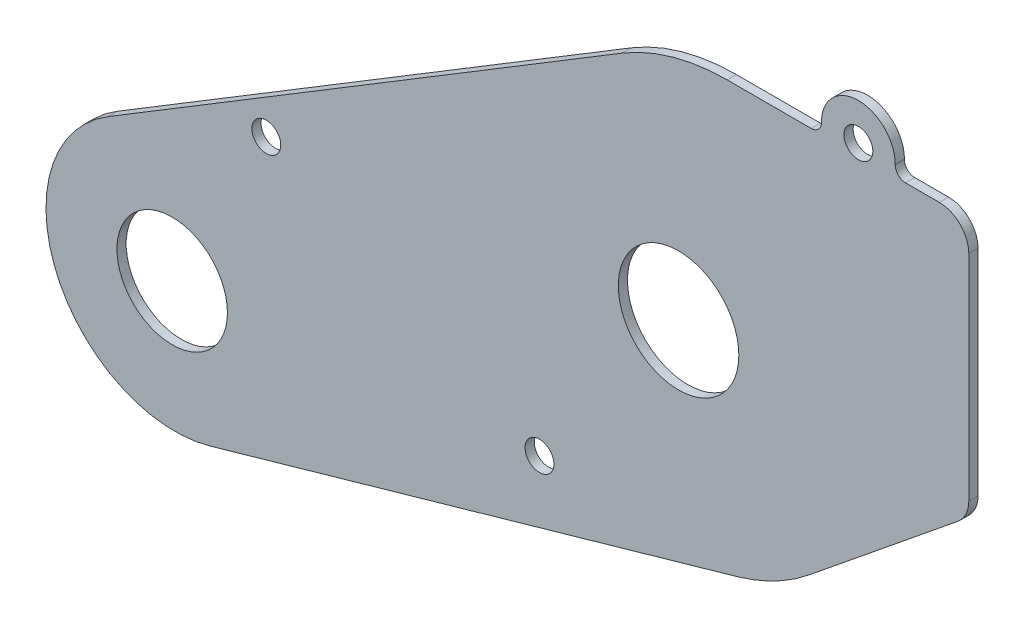
ISO-10303-21;
HEADER;
FILE_DESCRIPTION(('STEP AP214'),'2;1');
FILE_NAME('part.step','',(''),(''),'','','');
FILE_SCHEMA(('AUTOMOTIVE_DESIGN { 1 0 10303 214 1 1 1 1 }'));
ENDSEC;
DATA;
#1=APPLICATION_CONTEXT('core data for automotive mechanical design processes');
#2=APPLICATION_PROTOCOL_DEFINITION('international standard','automotive_design',2000,#1);
#3=PRODUCT_CONTEXT('',#1,'mechanical');
#4=PRODUCT('Part','Part','',(#3));
#5=PRODUCT_RELATED_PRODUCT_CATEGORY('part','',(#4));
#6=PRODUCT_DEFINITION_FORMATION('','',#4);
#7=PRODUCT_DEFINITION_CONTEXT('part definition',#1,'design');
#8=PRODUCT_DEFINITION('design','',#6,#7);
#9=PRODUCT_DEFINITION_SHAPE('','',#8);
#10=(LENGTH_UNIT() NAMED_UNIT(*) SI_UNIT(.MILLI.,.METRE.));
#11=(NAMED_UNIT(*) PLANE_ANGLE_UNIT() SI_UNIT($,.RADIAN.));
#12=(NAMED_UNIT(*) SI_UNIT($,.STERADIAN.) SOLID_ANGLE_UNIT());
#13=UNCERTAINTY_MEASURE_WITH_UNIT(LENGTH_MEASURE(1.E-05),#10,'distance_accuracy_value','');
#14=(GEOMETRIC_REPRESENTATION_CONTEXT(3) GLOBAL_UNCERTAINTY_ASSIGNED_CONTEXT((#13)) GLOBAL_UNIT_ASSIGNED_CONTEXT((#10,
#11,#12)) REPRESENTATION_CONTEXT('',''));
#15=CARTESIAN_POINT('',(0.,0.,0.));
#16=DIRECTION('',(0.,0.,1.));
#17=DIRECTION('',(1.,0.,0.));
#18=AXIS2_PLACEMENT_3D('',#15,#16,#17);
#19=CARTESIAN_POINT('',(59.9572586316337,16.1220844149742,0.));
#20=DIRECTION('',(0.,0.,-1.));
#21=DIRECTION('',(-1.,0.,0.));
#22=AXIS2_PLACEMENT_3D('',#19,#20,#21);
#23=PLANE('',#22);
#24=CARTESIAN_POINT('',(-56.0413692587368,-27.0192229282856,0.));
#25=DIRECTION('',(0.,0.,1.));
#26=DIRECTION('',(1.,0.,0.));
#27=AXIS2_PLACEMENT_3D('',#24,#25,#26);
#28=CIRCLE('',#27,2.4892);
#29=CARTESIAN_POINT('',(-53.5521692587368,-27.0192229282856,0.));
#30=VERTEX_POINT('',#29);
#31=EDGE_CURVE('E342',#30,#30,#28,.T.);
#32=ORIENTED_EDGE('',*,*,#31,.T.);
#33=EDGE_LOOP('',(#32));
#34=FACE_BOUND('',#33,.T.);
#35=CARTESIAN_POINT('',(15.0168097118273,-18.8830683034896,0.));
#36=DIRECTION('',(0.,0.,1.));
#37=DIRECTION('',(1.,0.,0.));
#38=AXIS2_PLACEMENT_3D('',#35,#36,#37);
#39=CIRCLE('',#38,10.3876930189916);
#40=CARTESIAN_POINT('',(25.404502730819,-18.8830683034896,0.));
#41=VERTEX_POINT('',#40);
#42=EDGE_CURVE('E361',#41,#41,#39,.T.);
#43=ORIENTED_EDGE('',*,*,#42,.T.);
#44=EDGE_LOOP('',(#43));
#45=FACE_BOUND('',#44,.T.);
#46=CARTESIAN_POINT('',(59.9572586316337,16.1220844149742,0.));
#47=DIRECTION('',(0.,0.,1.));
#48=DIRECTION('',(-1.,0.,0.));
#49=AXIS2_PLACEMENT_3D('',#46,#47,#48);
#50=CIRCLE('',#49,5.08);
#51=CARTESIAN_POINT('',(65.0372586316337,16.1220844149741,0.));
#52=VERTEX_POINT('',#51);
#53=CARTESIAN_POINT('',(59.9572586316337,21.2020844149742,0.));
#54=VERTEX_POINT('',#53);
#55=EDGE_CURVE('E183',#52,#54,#50,.T.);
#56=ORIENTED_EDGE('',*,*,#55,.F.);
#57=DIRECTION('',(0.,1.,0.));
#58=VECTOR('',#57,1.);
#59=CARTESIAN_POINT('',(65.0372586316337,16.1220844149741,0.));
#60=LINE('',#59,#58);
#61=CARTESIAN_POINT('',(65.0372586316337,-20.8619232159134,0.));
#62=VERTEX_POINT('',#61);
#63=EDGE_CURVE('E113',#62,#52,#60,.T.);
#64=ORIENTED_EDGE('',*,*,#63,.F.);
#65=CARTESIAN_POINT('',(59.9572586316337,-20.8619232159134,0.));
#66=DIRECTION('',(0.,0.,1.));
#67=DIRECTION('',(1.,0.,0.));
#68=AXIS2_PLACEMENT_3D('',#65,#66,#67);
#69=CIRCLE('',#68,5.08);
#70=CARTESIAN_POINT('',(63.1592160975954,-24.8057625110891,0.));
#71=VERTEX_POINT('',#70);
#72=EDGE_CURVE('E107',#71,#62,#69,.T.);
#73=ORIENTED_EDGE('',*,*,#72,.F.);
#74=DIRECTION('',(0.776346317947978,0.630306587787735,0.));
#75=VECTOR('',#74,1.);
#76=CARTESIAN_POINT('',(63.1592160975954,-24.8057625110891,0.));
#77=LINE('',#76,#75);
#78=CARTESIAN_POINT('',(37.5194662101181,-45.6223786135818,0.));
#79=VERTEX_POINT('',#78);
#80=EDGE_CURVE('E173',#79,#71,#77,.T.);
#81=ORIENTED_EDGE('',*,*,#80,.F.);
#82=CARTESIAN_POINT('',(15.5060086316314,-18.5084834592487,0.));
#83=DIRECTION('',(0.,0.,1.));
#84=DIRECTION('',(-1.,0.,0.));
#85=AXIS2_PLACEMENT_3D('',#82,#83,#84);
#86=CIRCLE('',#85,34.925);
#87=CARTESIAN_POINT('',(25.0910579064422,-52.0924447413764,0.));
#88=VERTEX_POINT('',#87);
#89=EDGE_CURVE('E209',#88,#79,#86,.T.);
#90=ORIENTED_EDGE('',*,*,#89,.F.);
#91=DIRECTION('',(0.961602327333648,0.274446650674611,0.));
#92=VECTOR('',#91,1.);
#93=CARTESIAN_POINT('',(25.0910579064422,-52.0924447413764,0.));
#94=LINE('',#93,#92);
#95=CARTESIAN_POINT('',(-65.683756134902,-78.0000813715169,0.));
#96=VERTEX_POINT('',#95);
#97=EDGE_CURVE('E207',#96,#88,#94,.T.);
#98=ORIENTED_EDGE('',*,*,#97,.F.);
#99=CARTESIAN_POINT('',(-71.7833329461452,-56.6284696465266,0.));
#100=DIRECTION('',(0.,0.,1.));
#101=DIRECTION('',(1.,0.,0.));
#102=AXIS2_PLACEMENT_3D('',#99,#100,#101);
#103=CIRCLE('',#102,22.2249999999999);
#104=CARTESIAN_POINT('',(-83.3142465666712,-37.6287681731886,0.));
#105=VERTEX_POINT('',#104);
#106=EDGE_CURVE('E205',#105,#96,#103,.T.);
#107=ORIENTED_EDGE('',*,*,#106,.F.);
#108=DIRECTION('',(-0.854879706336895,-0.518826259641265,0.));
#109=VECTOR('',#108,1.);
#110=CARTESIAN_POINT('',(-83.3142465666712,-37.6287681731886,0.));
#111=LINE('',#110,#109);
#112=CARTESIAN_POINT('',(5.27127097130059,16.1337581587901,0.));
#113=VERTEX_POINT('',#112);
#114=EDGE_CURVE('E203',#113,#105,#111,.T.);
#115=ORIENTED_EDGE('',*,*,#114,.F.);
#116=CARTESIAN_POINT('',(23.3912780892719,-13.7229155850258,0.));
#117=DIRECTION('',(0.,0.,1.));
#118=DIRECTION('',(-1.,0.,0.));
#119=AXIS2_PLACEMENT_3D('',#116,#117,#118);
#120=CIRCLE('',#119,34.925);
#121=CARTESIAN_POINT('',(23.391278089272,21.2020844149742,0.));
#122=VERTEX_POINT('',#121);
#123=EDGE_CURVE('E201',#122,#113,#120,.T.);
#124=ORIENTED_EDGE('',*,*,#123,.F.);
#125=DIRECTION('',(-1.,0.,0.));
#126=VECTOR('',#125,1.);
#127=CARTESIAN_POINT('',(37.8790874286254,21.2020844149742,0.));
#128=LINE('',#127,#126);
#129=CARTESIAN_POINT('',(37.8790874286254,21.2020844149742,0.));
#130=VERTEX_POINT('',#129);
#131=EDGE_CURVE('E199',#130,#122,#128,.T.);
#132=ORIENTED_EDGE('',*,*,#131,.F.);
#133=CARTESIAN_POINT('',(37.8790874286254,22.9800844149742,0.));
#134=DIRECTION('',(0.,0.,-1.));
#135=DIRECTION('',(-1.,0.,0.));
#136=AXIS2_PLACEMENT_3D('',#133,#134,#135);
#137=CIRCLE('',#136,1.778);
#138=CARTESIAN_POINT('',(39.6570874286254,22.9800844149742,0.));
#139=VERTEX_POINT('',#138);
#140=EDGE_CURVE('E197',#139,#130,#137,.T.);
#141=ORIENTED_EDGE('',*,*,#140,.F.);
#142=DIRECTION('',(0.,-1.,0.));
#143=VECTOR('',#142,1.);
#144=CARTESIAN_POINT('',(39.6570874286254,23.0853221728369,0.));
#145=LINE('',#144,#143);
#146=CARTESIAN_POINT('',(39.6570874286254,23.0853221728369,0.));
#147=VERTEX_POINT('',#146);
#148=EDGE_CURVE('E195',#147,#139,#145,.T.);
#149=ORIENTED_EDGE('',*,*,#148,.F.);
#150=CARTESIAN_POINT('',(46.0070874286257,23.0853221728365,0.));
#151=DIRECTION('',(0.,0.,1.));
#152=DIRECTION('',(1.,0.,0.));
#153=AXIS2_PLACEMENT_3D('',#150,#151,#152);
#154=CIRCLE('',#153,6.35000000000033);
#155=CARTESIAN_POINT('',(52.3570874286261,23.0853221728362,0.));
#156=VERTEX_POINT('',#155);
#157=EDGE_CURVE('E193',#156,#147,#154,.T.);
#158=ORIENTED_EDGE('',*,*,#157,.F.);
#159=DIRECTION('',(0.,1.,0.));
#160=VECTOR('',#159,1.);
#161=CARTESIAN_POINT('',(52.3570874286261,23.0853221728362,0.));
#162=LINE('',#161,#160);
#163=CARTESIAN_POINT('',(52.3570874286261,22.9800844149742,0.));
#164=VERTEX_POINT('',#163);
#165=EDGE_CURVE('E191',#164,#156,#162,.T.);
#166=ORIENTED_EDGE('',*,*,#165,.F.);
#167=CARTESIAN_POINT('',(54.1350874286261,22.9800844149742,0.));
#168=DIRECTION('',(0.,0.,-1.));
#169=DIRECTION('',(1.,0.,0.));
#170=AXIS2_PLACEMENT_3D('',#167,#168,#169);
#171=CIRCLE('',#170,1.778);
#172=CARTESIAN_POINT('',(54.1350874286261,21.2020844149742,0.));
#173=VERTEX_POINT('',#172);
#174=EDGE_CURVE('E189',#173,#164,#171,.T.);
#175=ORIENTED_EDGE('',*,*,#174,.F.);
#176=DIRECTION('',(-1.,0.,0.));
#177=VECTOR('',#176,1.);
#178=CARTESIAN_POINT('',(54.1350874286261,21.2020844149742,0.));
#179=LINE('',#178,#177);
#180=EDGE_CURVE('E186',#54,#173,#179,.T.);
#181=ORIENTED_EDGE('',*,*,#180,.F.);
#182=EDGE_LOOP('',(#56,#64,#73,#81,#90,#98,#107,#115,#124,#132,#141,#149,#158,#166,#175,#181));
#183=FACE_BOUND('',#182,.T.);
#184=CARTESIAN_POINT('',(-72.2583329461425,-56.6284683854276,0.));
#185=DIRECTION('',(0.,0.,1.));
#186=DIRECTION('',(1.,0.,0.));
#187=AXIS2_PLACEMENT_3D('',#184,#185,#186);
#188=CIRCLE('',#187,9.52499999999976);
#189=CARTESIAN_POINT('',(-62.7333329461428,-56.6284683854276,0.));
#190=VERTEX_POINT('',#189);
#191=EDGE_CURVE('E365',#190,#190,#188,.T.);
#192=ORIENTED_EDGE('',*,*,#191,.T.);
#193=EDGE_LOOP('',(#192));
#194=FACE_BOUND('',#193,.T.);
#195=CARTESIAN_POINT('',(46.0070874286257,23.0853221728365,0.));
#196=DIRECTION('',(0.,0.,1.));
#197=DIRECTION('',(1.,0.,0.));
#198=AXIS2_PLACEMENT_3D('',#195,#196,#197);
#199=CIRCLE('',#198,2.4892);
#200=CARTESIAN_POINT('',(48.4962874286257,23.0853221728365,0.));
#201=VERTEX_POINT('',#200);
#202=EDGE_CURVE('E358',#201,#201,#199,.T.);
#203=ORIENTED_EDGE('',*,*,#202,.T.);
#204=EDGE_LOOP('',(#203));
#205=FACE_BOUND('',#204,.T.);
#206=CARTESIAN_POINT('',(-8.95127708125045,-51.0906306621196,0.));
#207=DIRECTION('',(0.,0.,1.));
#208=DIRECTION('',(1.,0.,0.));
#209=AXIS2_PLACEMENT_3D('',#206,#207,#208);
#210=CIRCLE('',#209,2.4892);
#211=CARTESIAN_POINT('',(-6.46207708125046,-51.0906306621196,0.));
#212=VERTEX_POINT('',#211);
#213=EDGE_CURVE('E352',#212,#212,#210,.T.);
#214=ORIENTED_EDGE('',*,*,#213,.T.);
#215=EDGE_LOOP('',(#214));
#216=FACE_BOUND('',#215,.T.);
#217=ADVANCED_FACE('F37',(#34,#45,#183,#194,#205,#216),#23,.T.);
#218=CARTESIAN_POINT('',(59.9572586316337,16.1220844149742,1.5875));
#219=DIRECTION('',(0.,0.,-1.));
#220=DIRECTION('',(-1.,0.,0.));
#221=AXIS2_PLACEMENT_3D('',#218,#219,#220);
#222=PLANE('',#221);
#223=CARTESIAN_POINT('',(-56.0413692587368,-27.0192229282856,1.5875));
#224=DIRECTION('',(0.,0.,1.));
#225=DIRECTION('',(1.,0.,0.));
#226=AXIS2_PLACEMENT_3D('',#223,#224,#225);
#227=CIRCLE('',#226,2.4892);
#228=CARTESIAN_POINT('',(-53.5521692587368,-27.0192229282856,1.5875));
#229=VERTEX_POINT('',#228);
#230=EDGE_CURVE('E345',#229,#229,#227,.T.);
#231=ORIENTED_EDGE('',*,*,#230,.F.);
#232=EDGE_LOOP('',(#231));
#233=FACE_BOUND('',#232,.T.);
#234=CARTESIAN_POINT('',(-8.95127708125045,-51.0906306621196,1.5875));
#235=DIRECTION('',(0.,0.,1.));
#236=DIRECTION('',(1.,0.,0.));
#237=AXIS2_PLACEMENT_3D('',#234,#235,#236);
#238=CIRCLE('',#237,2.4892);
#239=CARTESIAN_POINT('',(-6.46207708125046,-51.0906306621196,1.5875));
#240=VERTEX_POINT('',#239);
#241=EDGE_CURVE('E347',#240,#240,#238,.T.);
#242=ORIENTED_EDGE('',*,*,#241,.F.);
#243=EDGE_LOOP('',(#242));
#244=FACE_BOUND('',#243,.T.);
#245=CARTESIAN_POINT('',(46.0070874286257,23.0853221728365,1.5875));
#246=DIRECTION('',(0.,0.,1.));
#247=DIRECTION('',(1.,0.,0.));
#248=AXIS2_PLACEMENT_3D('',#245,#246,#247);
#249=CIRCLE('',#248,2.4892);
#250=CARTESIAN_POINT('',(48.4962874286257,23.0853221728365,1.5875));
#251=VERTEX_POINT('',#250);
#252=EDGE_CURVE('E355',#251,#251,#249,.T.);
#253=ORIENTED_EDGE('',*,*,#252,.F.);
#254=EDGE_LOOP('',(#253));
#255=FACE_BOUND('',#254,.T.);
#256=CARTESIAN_POINT('',(59.9572586316337,16.1220844149742,1.5875));
#257=DIRECTION('',(0.,0.,1.));
#258=DIRECTION('',(-1.,0.,0.));
#259=AXIS2_PLACEMENT_3D('',#256,#257,#258);
#260=CIRCLE('',#259,5.08);
#261=CARTESIAN_POINT('',(65.0372586316337,16.1220844149741,1.5875));
#262=VERTEX_POINT('',#261);
#263=CARTESIAN_POINT('',(59.9572586316337,21.2020844149742,1.5875));
#264=VERTEX_POINT('',#263);
#265=EDGE_CURVE('E214',#262,#264,#260,.T.);
#266=ORIENTED_EDGE('',*,*,#265,.T.);
#267=DIRECTION('',(-1.,0.,0.));
#268=VECTOR('',#267,1.);
#269=CARTESIAN_POINT('',(54.1350874286261,21.2020844149742,1.5875));
#270=LINE('',#269,#268);
#271=CARTESIAN_POINT('',(54.1350874286261,21.2020844149742,1.5875));
#272=VERTEX_POINT('',#271);
#273=EDGE_CURVE('E121',#264,#272,#270,.T.);
#274=ORIENTED_EDGE('',*,*,#273,.T.);
#275=CARTESIAN_POINT('',(54.1350874286261,22.9800844149742,1.5875));
#276=DIRECTION('',(0.,0.,-1.));
#277=DIRECTION('',(1.,0.,0.));
#278=AXIS2_PLACEMENT_3D('',#275,#276,#277);
#279=CIRCLE('',#278,1.778);
#280=CARTESIAN_POINT('',(52.3570874286261,22.9800844149742,1.5875));
#281=VERTEX_POINT('',#280);
#282=EDGE_CURVE('E253',#272,#281,#279,.T.);
#283=ORIENTED_EDGE('',*,*,#282,.T.);
#284=DIRECTION('',(0.,1.,0.));
#285=VECTOR('',#284,1.);
#286=CARTESIAN_POINT('',(52.3570874286261,23.0853221728362,1.5875));
#287=LINE('',#286,#285);
#288=CARTESIAN_POINT('',(52.3570874286261,23.0853221728362,1.5875));
#289=VERTEX_POINT('',#288);
#290=EDGE_CURVE('E271',#281,#289,#287,.T.);
#291=ORIENTED_EDGE('',*,*,#290,.T.);
#292=CARTESIAN_POINT('',(46.0070874286257,23.0853221728365,1.5875));
#293=DIRECTION('',(0.,0.,1.));
#294=DIRECTION('',(1.,0.,0.));
#295=AXIS2_PLACEMENT_3D('',#292,#293,#294);
#296=CIRCLE('',#295,6.35000000000033);
#297=CARTESIAN_POINT('',(39.6570874286254,23.0853221728369,1.5875));
#298=VERTEX_POINT('',#297);
#299=EDGE_CURVE('E268',#289,#298,#296,.T.);
#300=ORIENTED_EDGE('',*,*,#299,.T.);
#301=DIRECTION('',(0.,-1.,0.));
#302=VECTOR('',#301,1.);
#303=CARTESIAN_POINT('',(39.6570874286254,23.0853221728369,1.5875));
#304=LINE('',#303,#302);
#305=CARTESIAN_POINT('',(39.6570874286254,22.9800844149742,1.5875));
#306=VERTEX_POINT('',#305);
#307=EDGE_CURVE('E270',#298,#306,#304,.T.);
#308=ORIENTED_EDGE('',*,*,#307,.T.);
#309=CARTESIAN_POINT('',(37.8790874286254,22.9800844149742,1.5875));
#310=DIRECTION('',(0.,0.,-1.));
#311=DIRECTION('',(-1.,0.,0.));
#312=AXIS2_PLACEMENT_3D('',#309,#310,#311);
#313=CIRCLE('',#312,1.778);
#314=CARTESIAN_POINT('',(37.8790874286254,21.2020844149742,1.5875));
#315=VERTEX_POINT('',#314);
#316=EDGE_CURVE('E273',#306,#315,#313,.T.);
#317=ORIENTED_EDGE('',*,*,#316,.T.);
#318=DIRECTION('',(-1.,0.,0.));
#319=VECTOR('',#318,1.);
#320=CARTESIAN_POINT('',(37.8790874286254,21.2020844149742,1.5875));
#321=LINE('',#320,#319);
#322=CARTESIAN_POINT('',(23.391278089272,21.2020844149742,1.5875));
#323=VERTEX_POINT('',#322);
#324=EDGE_CURVE('E279',#315,#323,#321,.T.);
#325=ORIENTED_EDGE('',*,*,#324,.T.);
#326=CARTESIAN_POINT('',(23.3912780892719,-13.7229155850258,1.5875));
#327=DIRECTION('',(0.,0.,1.));
#328=DIRECTION('',(-1.,0.,0.));
#329=AXIS2_PLACEMENT_3D('',#326,#327,#328);
#330=CIRCLE('',#329,34.925);
#331=CARTESIAN_POINT('',(5.27127097130059,16.1337581587901,1.5875));
#332=VERTEX_POINT('',#331);
#333=EDGE_CURVE('E281',#323,#332,#330,.T.);
#334=ORIENTED_EDGE('',*,*,#333,.T.);
#335=DIRECTION('',(-0.854879706336895,-0.518826259641265,0.));
#336=VECTOR('',#335,1.);
#337=CARTESIAN_POINT('',(-83.3142465666712,-37.6287681731886,1.5875));
#338=LINE('',#337,#336);
#339=CARTESIAN_POINT('',(-83.3142465666712,-37.6287681731886,1.5875));
#340=VERTEX_POINT('',#339);
#341=EDGE_CURVE('E283',#332,#340,#338,.T.);
#342=ORIENTED_EDGE('',*,*,#341,.T.);
#343=CARTESIAN_POINT('',(-71.7833329461452,-56.6284696465266,1.5875));
#344=DIRECTION('',(0.,0.,1.));
#345=DIRECTION('',(1.,0.,0.));
#346=AXIS2_PLACEMENT_3D('',#343,#344,#345);
#347=CIRCLE('',#346,22.2249999999999);
#348=CARTESIAN_POINT('',(-65.683756134902,-78.0000813715169,1.5875));
#349=VERTEX_POINT('',#348);
#350=EDGE_CURVE('E285',#340,#349,#347,.T.);
#351=ORIENTED_EDGE('',*,*,#350,.T.);
#352=DIRECTION('',(0.961602327333648,0.274446650674611,0.));
#353=VECTOR('',#352,1.);
#354=CARTESIAN_POINT('',(25.0910579064422,-52.0924447413764,1.5875));
#355=LINE('',#354,#353);
#356=CARTESIAN_POINT('',(25.0910579064422,-52.0924447413764,1.5875));
#357=VERTEX_POINT('',#356);
#358=EDGE_CURVE('E287',#349,#357,#355,.T.);
#359=ORIENTED_EDGE('',*,*,#358,.T.);
#360=CARTESIAN_POINT('',(15.5060086316314,-18.5084834592487,1.5875));
#361=DIRECTION('',(0.,0.,1.));
#362=DIRECTION('',(-1.,0.,0.));
#363=AXIS2_PLACEMENT_3D('',#360,#361,#362);
#364=CIRCLE('',#363,34.925);
#365=CARTESIAN_POINT('',(37.5194662101181,-45.6223786135818,1.5875));
#366=VERTEX_POINT('',#365);
#367=EDGE_CURVE('E165',#357,#366,#364,.T.);
#368=ORIENTED_EDGE('',*,*,#367,.T.);
#369=DIRECTION('',(0.776346317947978,0.630306587787735,0.));
#370=VECTOR('',#369,1.);
#371=CARTESIAN_POINT('',(63.1592160975954,-24.8057625110891,1.5875));
#372=LINE('',#371,#370);
#373=CARTESIAN_POINT('',(63.1592160975954,-24.8057625110891,1.5875));
#374=VERTEX_POINT('',#373);
#375=EDGE_CURVE('E158',#366,#374,#372,.T.);
#376=ORIENTED_EDGE('',*,*,#375,.T.);
#377=CARTESIAN_POINT('',(59.9572586316337,-20.8619232159134,1.5875));
#378=DIRECTION('',(0.,0.,1.));
#379=DIRECTION('',(1.,0.,0.));
#380=AXIS2_PLACEMENT_3D('',#377,#378,#379);
#381=CIRCLE('',#380,5.08);
#382=CARTESIAN_POINT('',(65.0372586316337,-20.8619232159134,1.5875));
#383=VERTEX_POINT('',#382);
#384=EDGE_CURVE('E163',#374,#383,#381,.T.);
#385=ORIENTED_EDGE('',*,*,#384,.T.);
#386=DIRECTION('',(0.,1.,0.));
#387=VECTOR('',#386,1.);
#388=CARTESIAN_POINT('',(65.0372586316337,16.1220844149741,1.5875));
#389=LINE('',#388,#387);
#390=EDGE_CURVE('E54',#383,#262,#389,.T.);
#391=ORIENTED_EDGE('',*,*,#390,.T.);
#392=EDGE_LOOP('',(#266,#274,#283,#291,#300,#308,#317,#325,#334,#342,#351,#359,#368,#376,#385,#391));
#393=FACE_BOUND('',#392,.T.);
#394=CARTESIAN_POINT('',(-72.2583329461425,-56.6284683854276,1.5875));
#395=DIRECTION('',(0.,0.,1.));
#396=DIRECTION('',(1.,0.,0.));
#397=AXIS2_PLACEMENT_3D('',#394,#395,#396);
#398=CIRCLE('',#397,9.52499999999976);
#399=CARTESIAN_POINT('',(-62.7333329461428,-56.6284683854276,1.5875));
#400=VERTEX_POINT('',#399);
#401=EDGE_CURVE('E187',#400,#400,#398,.T.);
#402=ORIENTED_EDGE('',*,*,#401,.F.);
#403=EDGE_LOOP('',(#402));
#404=FACE_BOUND('',#403,.T.);
#405=CARTESIAN_POINT('',(15.0168097118273,-18.8830683034896,1.5875));
#406=DIRECTION('',(0.,0.,1.));
#407=DIRECTION('',(1.,0.,0.));
#408=AXIS2_PLACEMENT_3D('',#405,#406,#407);
#409=CIRCLE('',#408,10.3876930189916);
#410=CARTESIAN_POINT('',(25.404502730819,-18.8830683034896,1.5875));
#411=VERTEX_POINT('',#410);
#412=EDGE_CURVE('E362',#411,#411,#409,.T.);
#413=ORIENTED_EDGE('',*,*,#412,.F.);
#414=EDGE_LOOP('',(#413));
#415=FACE_BOUND('',#414,.T.);
#416=ADVANCED_FACE('F160',(#233,#244,#255,#393,#404,#415),#222,.F.);
#417=CARTESIAN_POINT('',(59.9572586316337,16.1220844149742,1.5875));
#418=DIRECTION('',(0.,0.,-1.));
#419=DIRECTION('',(-1.,0.,0.));
#420=AXIS2_PLACEMENT_3D('',#417,#418,#419);
#421=CYLINDRICAL_SURFACE('',#420,5.08);
#422=ORIENTED_EDGE('',*,*,#55,.T.);
#423=DIRECTION('',(0.,0.,-1.));
#424=VECTOR('',#423,1.);
#425=CARTESIAN_POINT('',(59.9572586316337,21.2020844149742,1.5875));
#426=LINE('',#425,#424);
#427=EDGE_CURVE('E11',#264,#54,#426,.T.);
#428=ORIENTED_EDGE('',*,*,#427,.F.);
#429=ORIENTED_EDGE('',*,*,#265,.F.);
#430=DIRECTION('',(0.,0.,-1.));
#431=VECTOR('',#430,1.);
#432=CARTESIAN_POINT('',(65.0372586316337,16.1220844149741,1.5875));
#433=LINE('',#432,#431);
#434=EDGE_CURVE('E179',#262,#52,#433,.T.);
#435=ORIENTED_EDGE('',*,*,#434,.T.);
#436=EDGE_LOOP('',(#422,#428,#429,#435));
#437=FACE_BOUND('',#436,.T.);
#438=ADVANCED_FACE('F39',(#437),#421,.T.);
#439=CARTESIAN_POINT('',(54.1350874286261,21.2020844149742,1.5875));
#440=DIRECTION('',(0.,-1.,0.));
#441=DIRECTION('',(1.,0.,0.));
#442=AXIS2_PLACEMENT_3D('',#439,#440,#441);
#443=PLANE('',#442);
#444=ORIENTED_EDGE('',*,*,#180,.T.);
#445=DIRECTION('',(0.,0.,-1.));
#446=VECTOR('',#445,1.);
#447=CARTESIAN_POINT('',(54.1350874286261,21.2020844149742,1.5875));
#448=LINE('',#447,#446);
#449=EDGE_CURVE('E46',#272,#173,#448,.T.);
#450=ORIENTED_EDGE('',*,*,#449,.F.);
#451=ORIENTED_EDGE('',*,*,#273,.F.);
#452=ORIENTED_EDGE('',*,*,#427,.T.);
#453=EDGE_LOOP('',(#444,#450,#451,#452));
#454=FACE_BOUND('',#453,.T.);
#455=ADVANCED_FACE('F540',(#454),#443,.F.);
#456=CARTESIAN_POINT('',(54.1350874286261,22.9800844149742,1.5875));
#457=DIRECTION('',(0.,0.,-1.));
#458=DIRECTION('',(-1.,0.,0.));
#459=AXIS2_PLACEMENT_3D('',#456,#457,#458);
#460=CYLINDRICAL_SURFACE('',#459,1.778);
#461=ORIENTED_EDGE('',*,*,#174,.T.);
#462=DIRECTION('',(0.,0.,-1.));
#463=VECTOR('',#462,1.);
#464=CARTESIAN_POINT('',(52.3570874286261,22.9800844149742,1.5875));
#465=LINE('',#464,#463);
#466=EDGE_CURVE('E245',#281,#164,#465,.T.);
#467=ORIENTED_EDGE('',*,*,#466,.F.);
#468=ORIENTED_EDGE('',*,*,#282,.F.);
#469=ORIENTED_EDGE('',*,*,#449,.T.);
#470=EDGE_LOOP('',(#461,#467,#468,#469));
#471=FACE_BOUND('',#470,.T.);
#472=ADVANCED_FACE('F251',(#471),#460,.F.);
#473=CARTESIAN_POINT('',(52.3570874286261,23.0853221728362,1.5875));
#474=DIRECTION('',(-1.,0.,0.));
#475=DIRECTION('',(0.,0.,1.));
#476=AXIS2_PLACEMENT_3D('',#473,#474,#475);
#477=PLANE('',#476);
#478=ORIENTED_EDGE('',*,*,#165,.T.);
#479=DIRECTION('',(0.,0.,-1.));
#480=VECTOR('',#479,1.);
#481=CARTESIAN_POINT('',(52.3570874286261,23.0853221728362,1.5875));
#482=LINE('',#481,#480);
#483=EDGE_CURVE('E242',#289,#156,#482,.T.);
#484=ORIENTED_EDGE('',*,*,#483,.F.);
#485=ORIENTED_EDGE('',*,*,#290,.F.);
#486=ORIENTED_EDGE('',*,*,#466,.T.);
#487=EDGE_LOOP('',(#478,#484,#485,#486));
#488=FACE_BOUND('',#487,.T.);
#489=ADVANCED_FACE('F262',(#488),#477,.F.);
#490=CARTESIAN_POINT('',(46.0070874286257,23.0853221728365,1.5875));
#491=DIRECTION('',(0.,0.,-1.));
#492=DIRECTION('',(-1.,0.,0.));
#493=AXIS2_PLACEMENT_3D('',#490,#491,#492);
#494=CYLINDRICAL_SURFACE('',#493,6.35000000000033);
#495=ORIENTED_EDGE('',*,*,#157,.T.);
#496=DIRECTION('',(0.,0.,-1.));
#497=VECTOR('',#496,1.);
#498=CARTESIAN_POINT('',(39.6570874286254,23.0853221728369,1.5875));
#499=LINE('',#498,#497);
#500=EDGE_CURVE('E239',#298,#147,#499,.T.);
#501=ORIENTED_EDGE('',*,*,#500,.F.);
#502=ORIENTED_EDGE('',*,*,#299,.F.);
#503=ORIENTED_EDGE('',*,*,#483,.T.);
#504=EDGE_LOOP('',(#495,#501,#502,#503));
#505=FACE_BOUND('',#504,.T.);
#506=ADVANCED_FACE('F266',(#505),#494,.T.);
#507=CARTESIAN_POINT('',(39.6570874286254,23.0853221728369,1.5875));
#508=DIRECTION('',(1.,0.,0.));
#509=DIRECTION('',(0.,0.,-1.));
#510=AXIS2_PLACEMENT_3D('',#507,#508,#509);
#511=PLANE('',#510);
#512=ORIENTED_EDGE('',*,*,#148,.T.);
#513=DIRECTION('',(0.,0.,-1.));
#514=VECTOR('',#513,1.);
#515=CARTESIAN_POINT('',(39.6570874286254,22.9800844149742,1.5875));
#516=LINE('',#515,#514);
#517=EDGE_CURVE('E236',#306,#139,#516,.T.);
#518=ORIENTED_EDGE('',*,*,#517,.F.);
#519=ORIENTED_EDGE('',*,*,#307,.F.);
#520=ORIENTED_EDGE('',*,*,#500,.T.);
#521=EDGE_LOOP('',(#512,#518,#519,#520));
#522=FACE_BOUND('',#521,.T.);
#523=ADVANCED_FACE('F501',(#522),#511,.F.);
#524=CARTESIAN_POINT('',(37.8790874286254,22.9800844149742,1.5875));
#525=DIRECTION('',(0.,0.,-1.));
#526=DIRECTION('',(-1.,0.,0.));
#527=AXIS2_PLACEMENT_3D('',#524,#525,#526);
#528=CYLINDRICAL_SURFACE('',#527,1.778);
#529=ORIENTED_EDGE('',*,*,#140,.T.);
#530=DIRECTION('',(0.,0.,-1.));
#531=VECTOR('',#530,1.);
#532=CARTESIAN_POINT('',(37.8790874286254,21.2020844149742,1.5875));
#533=LINE('',#532,#531);
#534=EDGE_CURVE('E233',#315,#130,#533,.T.);
#535=ORIENTED_EDGE('',*,*,#534,.F.);
#536=ORIENTED_EDGE('',*,*,#316,.F.);
#537=ORIENTED_EDGE('',*,*,#517,.T.);
#538=EDGE_LOOP('',(#529,#535,#536,#537));
#539=FACE_BOUND('',#538,.T.);
#540=ADVANCED_FACE('F490',(#539),#528,.F.);
#541=CARTESIAN_POINT('',(37.8790874286254,21.2020844149742,1.5875));
#542=DIRECTION('',(0.,-1.,0.));
#543=DIRECTION('',(1.,0.,0.));
#544=AXIS2_PLACEMENT_3D('',#541,#542,#543);
#545=PLANE('',#544);
#546=ORIENTED_EDGE('',*,*,#131,.T.);
#547=DIRECTION('',(0.,0.,-1.));
#548=VECTOR('',#547,1.);
#549=CARTESIAN_POINT('',(23.391278089272,21.2020844149742,1.5875));
#550=LINE('',#549,#548);
#551=EDGE_CURVE('E230',#323,#122,#550,.T.);
#552=ORIENTED_EDGE('',*,*,#551,.F.);
#553=ORIENTED_EDGE('',*,*,#324,.F.);
#554=ORIENTED_EDGE('',*,*,#534,.T.);
#555=EDGE_LOOP('',(#546,#552,#553,#554));
#556=FACE_BOUND('',#555,.T.);
#557=ADVANCED_FACE('F479',(#556),#545,.F.);
#558=CARTESIAN_POINT('',(23.3912780892719,-13.7229155850258,1.5875));
#559=DIRECTION('',(0.,0.,-1.));
#560=DIRECTION('',(-1.,0.,0.));
#561=AXIS2_PLACEMENT_3D('',#558,#559,#560);
#562=CYLINDRICAL_SURFACE('',#561,34.925);
#563=ORIENTED_EDGE('',*,*,#123,.T.);
#564=DIRECTION('',(0.,0.,-1.));
#565=VECTOR('',#564,1.);
#566=CARTESIAN_POINT('',(5.27127097130059,16.1337581587901,1.5875));
#567=LINE('',#566,#565);
#568=EDGE_CURVE('E227',#332,#113,#567,.T.);
#569=ORIENTED_EDGE('',*,*,#568,.F.);
#570=ORIENTED_EDGE('',*,*,#333,.F.);
#571=ORIENTED_EDGE('',*,*,#551,.T.);
#572=EDGE_LOOP('',(#563,#569,#570,#571));
#573=FACE_BOUND('',#572,.T.);
#574=ADVANCED_FACE('F468',(#573),#562,.T.);
#575=CARTESIAN_POINT('',(-83.3142465666712,-37.6287681731886,1.5875));
#576=DIRECTION('',(0.518826259641264,-0.854879706336895,0.));
#577=DIRECTION('',(0.854879706336895,0.518826259641265,0.));
#578=AXIS2_PLACEMENT_3D('',#575,#576,#577);
#579=PLANE('',#578);
#580=ORIENTED_EDGE('',*,*,#114,.T.);
#581=DIRECTION('',(0.,0.,-1.));
#582=VECTOR('',#581,1.);
#583=CARTESIAN_POINT('',(-83.3142465666712,-37.6287681731886,1.5875));
#584=LINE('',#583,#582);
#585=EDGE_CURVE('E224',#340,#105,#584,.T.);
#586=ORIENTED_EDGE('',*,*,#585,.F.);
#587=ORIENTED_EDGE('',*,*,#341,.F.);
#588=ORIENTED_EDGE('',*,*,#568,.T.);
#589=EDGE_LOOP('',(#580,#586,#587,#588));
#590=FACE_BOUND('',#589,.T.);
#591=ADVANCED_FACE('F457',(#590),#579,.F.);
#592=CARTESIAN_POINT('',(-71.7833329461452,-56.6284696465266,1.5875));
#593=DIRECTION('',(0.,0.,-1.));
#594=DIRECTION('',(-1.,0.,0.));
#595=AXIS2_PLACEMENT_3D('',#592,#593,#594);
#596=CYLINDRICAL_SURFACE('',#595,22.2249999999999);
#597=ORIENTED_EDGE('',*,*,#106,.T.);
#598=DIRECTION('',(0.,0.,-1.));
#599=VECTOR('',#598,1.);
#600=CARTESIAN_POINT('',(-65.683756134902,-78.0000813715169,1.5875));
#601=LINE('',#600,#599);
#602=EDGE_CURVE('E221',#349,#96,#601,.T.);
#603=ORIENTED_EDGE('',*,*,#602,.F.);
#604=ORIENTED_EDGE('',*,*,#350,.F.);
#605=ORIENTED_EDGE('',*,*,#585,.T.);
#606=EDGE_LOOP('',(#597,#603,#604,#605));
#607=FACE_BOUND('',#606,.T.);
#608=ADVANCED_FACE('F447',(#607),#596,.T.);
#609=CARTESIAN_POINT('',(25.0910579064422,-52.0924447413764,1.5875));
#610=DIRECTION('',(-0.274446650674611,0.961602327333648,0.));
#611=DIRECTION('',(-0.961602327333648,-0.274446650674611,0.));
#612=AXIS2_PLACEMENT_3D('',#609,#610,#611);
#613=PLANE('',#612);
#614=ORIENTED_EDGE('',*,*,#97,.T.);
#615=DIRECTION('',(0.,0.,-1.));
#616=VECTOR('',#615,1.);
#617=CARTESIAN_POINT('',(25.0910579064422,-52.0924447413764,1.5875));
#618=LINE('',#617,#616);
#619=EDGE_CURVE('E218',#357,#88,#618,.T.);
#620=ORIENTED_EDGE('',*,*,#619,.F.);
#621=ORIENTED_EDGE('',*,*,#358,.F.);
#622=ORIENTED_EDGE('',*,*,#602,.T.);
#623=EDGE_LOOP('',(#614,#620,#621,#622));
#624=FACE_BOUND('',#623,.T.);
#625=ADVANCED_FACE('F293',(#624),#613,.F.);
#626=CARTESIAN_POINT('',(15.5060086316314,-18.5084834592487,1.5875));
#627=DIRECTION('',(0.,0.,-1.));
#628=DIRECTION('',(-1.,0.,0.));
#629=AXIS2_PLACEMENT_3D('',#626,#627,#628);
#630=CYLINDRICAL_SURFACE('',#629,34.925);
#631=ORIENTED_EDGE('',*,*,#89,.T.);
#632=DIRECTION('',(0.,0.,-1.));
#633=VECTOR('',#632,1.);
#634=CARTESIAN_POINT('',(37.5194662101181,-45.6223786135818,1.5875));
#635=LINE('',#634,#633);
#636=EDGE_CURVE('E174',#366,#79,#635,.T.);
#637=ORIENTED_EDGE('',*,*,#636,.F.);
#638=ORIENTED_EDGE('',*,*,#367,.F.);
#639=ORIENTED_EDGE('',*,*,#619,.T.);
#640=EDGE_LOOP('',(#631,#637,#638,#639));
#641=FACE_BOUND('',#640,.T.);
#642=ADVANCED_FACE('F297',(#641),#630,.T.);
#643=CARTESIAN_POINT('',(63.1592160975954,-24.8057625110891,1.5875));
#644=DIRECTION('',(-0.630306587787735,0.776346317947978,0.));
#645=DIRECTION('',(-0.776346317947978,-0.630306587787735,0.));
#646=AXIS2_PLACEMENT_3D('',#643,#644,#645);
#647=PLANE('',#646);
#648=ORIENTED_EDGE('',*,*,#80,.T.);
#649=DIRECTION('',(0.,0.,-1.));
#650=VECTOR('',#649,1.);
#651=CARTESIAN_POINT('',(63.1592160975954,-24.8057625110891,1.5875));
#652=LINE('',#651,#650);
#653=EDGE_CURVE('E170',#374,#71,#652,.T.);
#654=ORIENTED_EDGE('',*,*,#653,.F.);
#655=ORIENTED_EDGE('',*,*,#375,.F.);
#656=ORIENTED_EDGE('',*,*,#636,.T.);
#657=EDGE_LOOP('',(#648,#654,#655,#656));
#658=FACE_BOUND('',#657,.T.);
#659=ADVANCED_FACE('F171',(#658),#647,.F.);
#660=CARTESIAN_POINT('',(59.9572586316337,-20.8619232159134,1.5875));
#661=DIRECTION('',(0.,0.,-1.));
#662=DIRECTION('',(-1.,0.,0.));
#663=AXIS2_PLACEMENT_3D('',#660,#661,#662);
#664=CYLINDRICAL_SURFACE('',#663,5.08);
#665=ORIENTED_EDGE('',*,*,#72,.T.);
#666=DIRECTION('',(0.,0.,-1.));
#667=VECTOR('',#666,1.);
#668=CARTESIAN_POINT('',(65.0372586316337,-20.8619232159134,1.5875));
#669=LINE('',#668,#667);
#670=EDGE_CURVE('E175',#383,#62,#669,.T.);
#671=ORIENTED_EDGE('',*,*,#670,.F.);
#672=ORIENTED_EDGE('',*,*,#384,.F.);
#673=ORIENTED_EDGE('',*,*,#653,.T.);
#674=EDGE_LOOP('',(#665,#671,#672,#673));
#675=FACE_BOUND('',#674,.T.);
#676=ADVANCED_FACE('F177',(#675),#664,.T.);
#677=CARTESIAN_POINT('',(65.0372586316337,16.1220844149741,1.5875));
#678=DIRECTION('',(-1.,0.,0.));
#679=DIRECTION('',(0.,0.,1.));
#680=AXIS2_PLACEMENT_3D('',#677,#678,#679);
#681=PLANE('',#680);
#682=ORIENTED_EDGE('',*,*,#63,.T.);
#683=ORIENTED_EDGE('',*,*,#434,.F.);
#684=ORIENTED_EDGE('',*,*,#390,.F.);
#685=ORIENTED_EDGE('',*,*,#670,.T.);
#686=EDGE_LOOP('',(#682,#683,#684,#685));
#687=FACE_BOUND('',#686,.T.);
#688=ADVANCED_FACE('F301',(#687),#681,.F.);
#689=CARTESIAN_POINT('',(-72.2583329461425,-56.6284683854276,1.5875));
#690=DIRECTION('',(0.,0.,-1.));
#691=DIRECTION('',(-1.,0.,0.));
#692=AXIS2_PLACEMENT_3D('',#689,#690,#691);
#693=CYLINDRICAL_SURFACE('',#692,9.52499999999976);
#694=ORIENTED_EDGE('',*,*,#401,.T.);
#695=EDGE_LOOP('',(#694));
#696=FACE_BOUND('',#695,.T.);
#697=ORIENTED_EDGE('',*,*,#191,.F.);
#698=EDGE_LOOP('',(#697));
#699=FACE_BOUND('',#698,.T.);
#700=ADVANCED_FACE('F303',(#696,#699),#693,.F.);
#701=CARTESIAN_POINT('',(15.0168097118273,-18.8830683034896,1.5875));
#702=DIRECTION('',(0.,0.,-1.));
#703=DIRECTION('',(-1.,0.,0.));
#704=AXIS2_PLACEMENT_3D('',#701,#702,#703);
#705=CYLINDRICAL_SURFACE('',#704,10.3876930189916);
#706=ORIENTED_EDGE('',*,*,#412,.T.);
#707=EDGE_LOOP('',(#706));
#708=FACE_BOUND('',#707,.T.);
#709=ORIENTED_EDGE('',*,*,#42,.F.);
#710=EDGE_LOOP('',(#709));
#711=FACE_BOUND('',#710,.T.);
#712=ADVANCED_FACE('F309',(#708,#711),#705,.F.);
#713=CARTESIAN_POINT('',(46.0070874286257,23.0853221728365,1.5875));
#714=DIRECTION('',(0.,0.,1.));
#715=DIRECTION('',(1.,0.,0.));
#716=AXIS2_PLACEMENT_3D('',#713,#714,#715);
#717=CYLINDRICAL_SURFACE('',#716,2.4892);
#718=ORIENTED_EDGE('',*,*,#202,.F.);
#719=EDGE_LOOP('',(#718));
#720=FACE_BOUND('',#719,.T.);
#721=ORIENTED_EDGE('',*,*,#252,.T.);
#722=EDGE_LOOP('',(#721));
#723=FACE_BOUND('',#722,.T.);
#724=ADVANCED_FACE('F326',(#720,#723),#717,.F.);
#725=CARTESIAN_POINT('',(-8.95127708125045,-51.0906306621196,1.5875));
#726=DIRECTION('',(0.,0.,1.));
#727=DIRECTION('',(1.,0.,0.));
#728=AXIS2_PLACEMENT_3D('',#725,#726,#727);
#729=CYLINDRICAL_SURFACE('',#728,2.4892);
#730=ORIENTED_EDGE('',*,*,#213,.F.);
#731=EDGE_LOOP('',(#730));
#732=FACE_BOUND('',#731,.T.);
#733=ORIENTED_EDGE('',*,*,#241,.T.);
#734=EDGE_LOOP('',(#733));
#735=FACE_BOUND('',#734,.T.);
#736=ADVANCED_FACE('F330',(#732,#735),#729,.F.);
#737=CARTESIAN_POINT('',(-56.0413692587368,-27.0192229282856,1.5875));
#738=DIRECTION('',(0.,0.,1.));
#739=DIRECTION('',(1.,0.,0.));
#740=AXIS2_PLACEMENT_3D('',#737,#738,#739);
#741=CYLINDRICAL_SURFACE('',#740,2.4892);
#742=ORIENTED_EDGE('',*,*,#31,.F.);
#743=EDGE_LOOP('',(#742));
#744=FACE_BOUND('',#743,.T.);
#745=ORIENTED_EDGE('',*,*,#230,.T.);
#746=EDGE_LOOP('',(#745));
#747=FACE_BOUND('',#746,.T.);
#748=ADVANCED_FACE('F334',(#744,#747),#741,.F.);
#749=CLOSED_SHELL('',(#217,#416,#438,#455,#472,#489,#506,#523,#540,#557,#574,#591,#608,#625,
#642,#659,#676,#688,#700,#712,#724,#736,#748));
#750=MANIFOLD_SOLID_BREP('B2',#749);
#751=ADVANCED_BREP_SHAPE_REPRESENTATION('',(#18,#750),#14);
#752=SHAPE_DEFINITION_REPRESENTATION(#9,#751);
ENDSEC;
END-ISO-10303-21;
